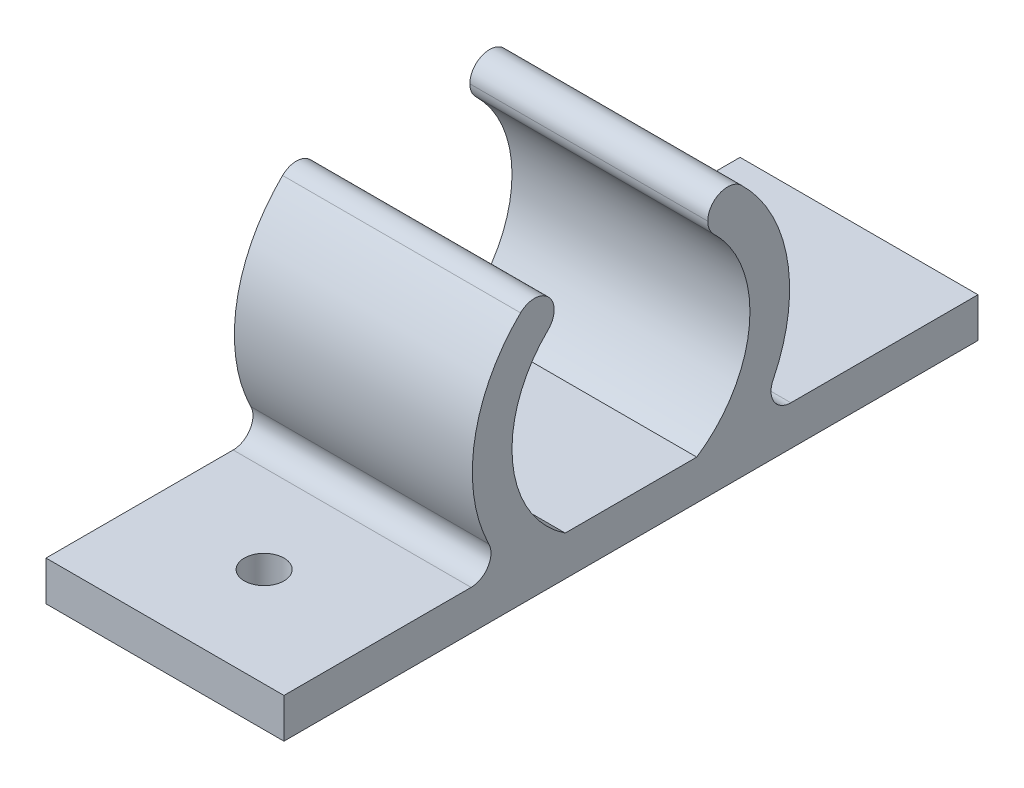
ISO-10303-21;
HEADER;
FILE_DESCRIPTION(('STEP AP214'),'2;1');
FILE_NAME('part.step','',(''),(''),'','','');
FILE_SCHEMA(('AUTOMOTIVE_DESIGN { 1 0 10303 214 1 1 1 1 }'));
ENDSEC;
DATA;
#1=APPLICATION_CONTEXT('core data for automotive mechanical design processes');
#2=APPLICATION_PROTOCOL_DEFINITION('international standard','automotive_design',2000,#1);
#3=PRODUCT_CONTEXT('',#1,'mechanical');
#4=PRODUCT('Part','Part','',(#3));
#5=PRODUCT_RELATED_PRODUCT_CATEGORY('part','',(#4));
#6=PRODUCT_DEFINITION_FORMATION('','',#4);
#7=PRODUCT_DEFINITION_CONTEXT('part definition',#1,'design');
#8=PRODUCT_DEFINITION('design','',#6,#7);
#9=PRODUCT_DEFINITION_SHAPE('','',#8);
#10=(LENGTH_UNIT() NAMED_UNIT(*) SI_UNIT(.MILLI.,.METRE.));
#11=(NAMED_UNIT(*) PLANE_ANGLE_UNIT() SI_UNIT($,.RADIAN.));
#12=(NAMED_UNIT(*) SI_UNIT($,.STERADIAN.) SOLID_ANGLE_UNIT());
#13=UNCERTAINTY_MEASURE_WITH_UNIT(LENGTH_MEASURE(1.E-05),#10,'distance_accuracy_value','');
#14=(GEOMETRIC_REPRESENTATION_CONTEXT(3) GLOBAL_UNCERTAINTY_ASSIGNED_CONTEXT((#13)) GLOBAL_UNIT_ASSIGNED_CONTEXT((#10,
#11,#12)) REPRESENTATION_CONTEXT('',''));
#15=CARTESIAN_POINT('',(0.,0.,0.));
#16=DIRECTION('',(0.,0.,1.));
#17=DIRECTION('',(1.,0.,0.));
#18=AXIS2_PLACEMENT_3D('',#15,#16,#17);
#19=CARTESIAN_POINT('',(12.,5.,-6.));
#20=DIRECTION('',(-1.,0.,0.));
#21=DIRECTION('',(0.,0.,1.));
#22=AXIS2_PLACEMENT_3D('',#19,#20,#21);
#23=CYLINDRICAL_SURFACE('',#22,8.);
#24=CARTESIAN_POINT('',(12.,5.,-6.));
#25=DIRECTION('',(1.,0.,0.));
#26=DIRECTION('',(0.,0.,-1.));
#27=AXIS2_PLACEMENT_3D('',#24,#25,#26);
#28=CIRCLE('',#27,8.);
#29=CARTESIAN_POINT('',(12.,10.7432447127312,-0.430876175762945));
#30=VERTEX_POINT('',#29);
#31=CARTESIAN_POINT('',(12.,1.44444444444444,1.16645133182093));
#32=VERTEX_POINT('',#31);
#33=EDGE_CURVE('E167',#30,#32,#28,.T.);
#34=ORIENTED_EDGE('',*,*,#33,.F.);
#35=DIRECTION('',(-1.,0.,0.));
#36=VECTOR('',#35,1.);
#37=CARTESIAN_POINT('',(12.,10.7432447127312,-0.430876175762943));
#38=LINE('',#37,#36);
#39=CARTESIAN_POINT('',(0.,10.7432447127312,-0.430876175762945));
#40=VERTEX_POINT('',#39);
#41=EDGE_CURVE('E269',#30,#40,#38,.T.);
#42=ORIENTED_EDGE('',*,*,#41,.T.);
#43=CARTESIAN_POINT('',(0.,5.,-6.));
#44=DIRECTION('',(1.,0.,0.));
#45=DIRECTION('',(0.,0.,-1.));
#46=AXIS2_PLACEMENT_3D('',#43,#44,#45);
#47=CIRCLE('',#46,8.);
#48=CARTESIAN_POINT('',(0.,1.44444444444444,1.16645133182093));
#49=VERTEX_POINT('',#48);
#50=EDGE_CURVE('E203',#40,#49,#47,.T.);
#51=ORIENTED_EDGE('',*,*,#50,.T.);
#52=DIRECTION('',(-1.,0.,0.));
#53=VECTOR('',#52,1.);
#54=CARTESIAN_POINT('',(12.,1.44444444444444,1.16645133182093));
#55=LINE('',#54,#53);
#56=EDGE_CURVE('E267',#49,#32,#55,.F.);
#57=ORIENTED_EDGE('',*,*,#56,.T.);
#58=EDGE_LOOP('',(#34,#42,#51,#57));
#59=FACE_BOUND('',#58,.T.);
#60=ADVANCED_FACE('F43',(#59),#23,.T.);
#61=CARTESIAN_POINT('',(12.,0.,0.));
#62=DIRECTION('',(0.,-1.,0.));
#63=DIRECTION('',(0.,0.,-1.));
#64=AXIS2_PLACEMENT_3D('',#61,#62,#63);
#65=PLANE('',#64);
#66=CARTESIAN_POINT('',(6.,0.,6.5));
#67=DIRECTION('',(0.,-1.,0.));
#68=DIRECTION('',(0.,0.,-1.));
#69=AXIS2_PLACEMENT_3D('',#66,#67,#68);
#70=CIRCLE('',#69,1.);
#71=CARTESIAN_POINT('',(6.,0.,5.5));
#72=VERTEX_POINT('',#71);
#73=EDGE_CURVE('E206',#72,#72,#70,.T.);
#74=ORIENTED_EDGE('',*,*,#73,.T.);
#75=EDGE_LOOP('',(#74));
#76=FACE_BOUND('',#75,.T.);
#77=DIRECTION('',(0.,0.,1.));
#78=VECTOR('',#77,1.);
#79=CARTESIAN_POINT('',(12.,0.,0.));
#80=LINE('',#79,#78);
#81=CARTESIAN_POINT('',(12.,0.,2.06225774829855));
#82=VERTEX_POINT('',#81);
#83=CARTESIAN_POINT('',(12.,0.,11.5));
#84=VERTEX_POINT('',#83);
#85=EDGE_CURVE('E156',#82,#84,#80,.T.);
#86=ORIENTED_EDGE('',*,*,#85,.F.);
#87=DIRECTION('',(1.,0.,0.));
#88=VECTOR('',#87,1.);
#89=CARTESIAN_POINT('',(0.,0.,2.06225774829855));
#90=LINE('',#89,#88);
#91=CARTESIAN_POINT('',(0.,0.,2.06225774829855));
#92=VERTEX_POINT('',#91);
#93=EDGE_CURVE('E273',#82,#92,#90,.F.);
#94=ORIENTED_EDGE('',*,*,#93,.T.);
#95=DIRECTION('',(0.,0.,1.));
#96=VECTOR('',#95,1.);
#97=CARTESIAN_POINT('',(0.,0.,0.));
#98=LINE('',#97,#96);
#99=CARTESIAN_POINT('',(0.,0.,11.5));
#100=VERTEX_POINT('',#99);
#101=EDGE_CURVE('E173',#92,#100,#98,.T.);
#102=ORIENTED_EDGE('',*,*,#101,.T.);
#103=DIRECTION('',(-1.,0.,0.));
#104=VECTOR('',#103,1.);
#105=CARTESIAN_POINT('',(12.,0.,11.5));
#106=LINE('',#105,#104);
#107=EDGE_CURVE('E170',#84,#100,#106,.T.);
#108=ORIENTED_EDGE('',*,*,#107,.F.);
#109=EDGE_LOOP('',(#86,#94,#102,#108));
#110=FACE_BOUND('',#109,.T.);
#111=ADVANCED_FACE('F171',(#76,#110),#65,.F.);
#112=CARTESIAN_POINT('',(12.,0.,11.5));
#113=DIRECTION('',(0.,0.,-1.));
#114=DIRECTION('',(-1.,0.,0.));
#115=AXIS2_PLACEMENT_3D('',#112,#113,#114);
#116=PLANE('',#115);
#117=DIRECTION('',(0.,-1.,0.));
#118=VECTOR('',#117,1.);
#119=CARTESIAN_POINT('',(0.,0.,11.5));
#120=LINE('',#119,#118);
#121=CARTESIAN_POINT('',(0.,-2.,11.5));
#122=VERTEX_POINT('',#121);
#123=EDGE_CURVE('E208',#100,#122,#120,.T.);
#124=ORIENTED_EDGE('',*,*,#123,.T.);
#125=DIRECTION('',(-1.,0.,0.));
#126=VECTOR('',#125,1.);
#127=CARTESIAN_POINT('',(12.,-2.,11.5));
#128=LINE('',#127,#126);
#129=CARTESIAN_POINT('',(12.,-2.,11.5));
#130=VERTEX_POINT('',#129);
#131=EDGE_CURVE('E177',#130,#122,#128,.T.);
#132=ORIENTED_EDGE('',*,*,#131,.F.);
#133=DIRECTION('',(0.,-1.,0.));
#134=VECTOR('',#133,1.);
#135=CARTESIAN_POINT('',(12.,0.,11.5));
#136=LINE('',#135,#134);
#137=EDGE_CURVE('E160',#84,#130,#136,.T.);
#138=ORIENTED_EDGE('',*,*,#137,.F.);
#139=ORIENTED_EDGE('',*,*,#107,.T.);
#140=EDGE_LOOP('',(#124,#132,#138,#139));
#141=FACE_BOUND('',#140,.T.);
#142=ADVANCED_FACE('F179',(#141),#116,.F.);
#143=CARTESIAN_POINT('',(12.,-2.,0.));
#144=DIRECTION('',(0.,1.,0.));
#145=DIRECTION('',(0.,0.,1.));
#146=AXIS2_PLACEMENT_3D('',#143,#144,#145);
#147=PLANE('',#146);
#148=CARTESIAN_POINT('',(6.,-2.,6.5));
#149=DIRECTION('',(0.,-1.,0.));
#150=DIRECTION('',(0.,0.,-1.));
#151=AXIS2_PLACEMENT_3D('',#148,#149,#150);
#152=CIRCLE('',#151,1.);
#153=CARTESIAN_POINT('',(6.,-2.,5.5));
#154=VERTEX_POINT('',#153);
#155=EDGE_CURVE('E242',#154,#154,#152,.T.);
#156=ORIENTED_EDGE('',*,*,#155,.F.);
#157=EDGE_LOOP('',(#156));
#158=FACE_BOUND('',#157,.T.);
#159=CARTESIAN_POINT('',(6.,-2.,-18.5));
#160=DIRECTION('',(0.,-1.,0.));
#161=DIRECTION('',(0.,0.,-1.));
#162=AXIS2_PLACEMENT_3D('',#159,#160,#161);
#163=CIRCLE('',#162,1.);
#164=CARTESIAN_POINT('',(6.,-2.,-19.5));
#165=VERTEX_POINT('',#164);
#166=EDGE_CURVE('E281',#165,#165,#163,.T.);
#167=ORIENTED_EDGE('',*,*,#166,.F.);
#168=EDGE_LOOP('',(#167));
#169=FACE_BOUND('',#168,.T.);
#170=DIRECTION('',(0.,0.,-1.));
#171=VECTOR('',#170,1.);
#172=CARTESIAN_POINT('',(0.,-2.,0.));
#173=LINE('',#172,#171);
#174=CARTESIAN_POINT('',(0.,-2.,-23.5));
#175=VERTEX_POINT('',#174);
#176=EDGE_CURVE('E210',#122,#175,#173,.T.);
#177=ORIENTED_EDGE('',*,*,#176,.T.);
#178=DIRECTION('',(-1.,0.,0.));
#179=VECTOR('',#178,1.);
#180=CARTESIAN_POINT('',(12.,-2.,-23.5));
#181=LINE('',#180,#179);
#182=CARTESIAN_POINT('',(12.,-2.,-23.5));
#183=VERTEX_POINT('',#182);
#184=EDGE_CURVE('E236',#183,#175,#181,.T.);
#185=ORIENTED_EDGE('',*,*,#184,.F.);
#186=DIRECTION('',(0.,0.,-1.));
#187=VECTOR('',#186,1.);
#188=CARTESIAN_POINT('',(12.,-2.,0.));
#189=LINE('',#188,#187);
#190=EDGE_CURVE('E182',#130,#183,#189,.T.);
#191=ORIENTED_EDGE('',*,*,#190,.F.);
#192=ORIENTED_EDGE('',*,*,#131,.T.);
#193=EDGE_LOOP('',(#177,#185,#191,#192));
#194=FACE_BOUND('',#193,.T.);
#195=ADVANCED_FACE('F318',(#158,#169,#194),#147,.F.);
#196=CARTESIAN_POINT('',(12.,0.,-23.5));
#197=DIRECTION('',(0.,0.,-1.));
#198=DIRECTION('',(-1.,0.,0.));
#199=AXIS2_PLACEMENT_3D('',#196,#197,#198);
#200=PLANE('',#199);
#201=DIRECTION('',(0.,-1.,0.));
#202=VECTOR('',#201,1.);
#203=CARTESIAN_POINT('',(0.,0.,-23.5));
#204=LINE('',#203,#202);
#205=CARTESIAN_POINT('',(0.,0.,-23.5));
#206=VERTEX_POINT('',#205);
#207=EDGE_CURVE('E213',#206,#175,#204,.T.);
#208=ORIENTED_EDGE('',*,*,#207,.F.);
#209=DIRECTION('',(-1.,0.,0.));
#210=VECTOR('',#209,1.);
#211=CARTESIAN_POINT('',(12.,0.,-23.5));
#212=LINE('',#211,#210);
#213=CARTESIAN_POINT('',(12.,0.,-23.5));
#214=VERTEX_POINT('',#213);
#215=EDGE_CURVE('E233',#214,#206,#212,.T.);
#216=ORIENTED_EDGE('',*,*,#215,.F.);
#217=DIRECTION('',(0.,-1.,0.));
#218=VECTOR('',#217,1.);
#219=CARTESIAN_POINT('',(12.,0.,-23.5));
#220=LINE('',#219,#218);
#221=EDGE_CURVE('E184',#214,#183,#220,.T.);
#222=ORIENTED_EDGE('',*,*,#221,.T.);
#223=ORIENTED_EDGE('',*,*,#184,.T.);
#224=EDGE_LOOP('',(#208,#216,#222,#223));
#225=FACE_BOUND('',#224,.T.);
#226=ADVANCED_FACE('F314',(#225),#200,.T.);
#227=CARTESIAN_POINT('',(12.,0.,0.));
#228=DIRECTION('',(0.,1.,0.));
#229=DIRECTION('',(0.,0.,1.));
#230=AXIS2_PLACEMENT_3D('',#227,#228,#229);
#231=PLANE('',#230);
#232=CARTESIAN_POINT('',(6.,0.,-18.5));
#233=DIRECTION('',(0.,1.,0.));
#234=DIRECTION('',(0.,0.,1.));
#235=AXIS2_PLACEMENT_3D('',#232,#233,#234);
#236=CIRCLE('',#235,1.);
#237=CARTESIAN_POINT('',(6.,0.,-19.5));
#238=VERTEX_POINT('',#237);
#239=EDGE_CURVE('E239',#238,#238,#236,.T.);
#240=ORIENTED_EDGE('',*,*,#239,.F.);
#241=EDGE_LOOP('',(#240));
#242=FACE_BOUND('',#241,.T.);
#243=DIRECTION('',(0.,0.,-1.));
#244=VECTOR('',#243,1.);
#245=CARTESIAN_POINT('',(0.,0.,0.));
#246=LINE('',#245,#244);
#247=CARTESIAN_POINT('',(0.,0.,-14.0622577482986));
#248=VERTEX_POINT('',#247);
#249=EDGE_CURVE('E216',#248,#206,#246,.T.);
#250=ORIENTED_EDGE('',*,*,#249,.F.);
#251=DIRECTION('',(-1.,0.,0.));
#252=VECTOR('',#251,1.);
#253=CARTESIAN_POINT('',(12.,0.,-14.0622577482986));
#254=LINE('',#253,#252);
#255=CARTESIAN_POINT('',(12.,0.,-14.0622577482986));
#256=VERTEX_POINT('',#255);
#257=EDGE_CURVE('E271',#248,#256,#254,.F.);
#258=ORIENTED_EDGE('',*,*,#257,.T.);
#259=DIRECTION('',(0.,0.,-1.));
#260=VECTOR('',#259,1.);
#261=CARTESIAN_POINT('',(12.,0.,0.));
#262=LINE('',#261,#260);
#263=EDGE_CURVE('E190',#256,#214,#262,.T.);
#264=ORIENTED_EDGE('',*,*,#263,.T.);
#265=ORIENTED_EDGE('',*,*,#215,.T.);
#266=EDGE_LOOP('',(#250,#258,#264,#265));
#267=FACE_BOUND('',#266,.T.);
#268=ADVANCED_FACE('F308',(#242,#267),#231,.T.);
#269=CARTESIAN_POINT('',(12.,5.,-6.));
#270=DIRECTION('',(-1.,0.,0.));
#271=DIRECTION('',(0.,0.,1.));
#272=AXIS2_PLACEMENT_3D('',#269,#270,#271);
#273=CYLINDRICAL_SURFACE('',#272,8.);
#274=CARTESIAN_POINT('',(0.,5.,-6.));
#275=DIRECTION('',(1.,0.,0.));
#276=DIRECTION('',(0.,0.,-1.));
#277=AXIS2_PLACEMENT_3D('',#274,#275,#276);
#278=CIRCLE('',#277,8.);
#279=CARTESIAN_POINT('',(0.,1.44444444444445,-13.1664513318209));
#280=VERTEX_POINT('',#279);
#281=CARTESIAN_POINT('',(0.,10.7432447127312,-11.5691238242371));
#282=VERTEX_POINT('',#281);
#283=EDGE_CURVE('E218',#280,#282,#278,.T.);
#284=ORIENTED_EDGE('',*,*,#283,.T.);
#285=DIRECTION('',(-1.,0.,0.));
#286=VECTOR('',#285,1.);
#287=CARTESIAN_POINT('',(12.,10.7432447127312,-11.5691238242371));
#288=LINE('',#287,#286);
#289=CARTESIAN_POINT('',(12.,10.7432447127312,-11.5691238242371));
#290=VERTEX_POINT('',#289);
#291=EDGE_CURVE('E265',#282,#290,#288,.F.);
#292=ORIENTED_EDGE('',*,*,#291,.T.);
#293=CARTESIAN_POINT('',(12.,5.,-6.));
#294=DIRECTION('',(1.,0.,0.));
#295=DIRECTION('',(0.,0.,-1.));
#296=AXIS2_PLACEMENT_3D('',#293,#294,#295);
#297=CIRCLE('',#296,8.);
#298=CARTESIAN_POINT('',(12.,1.44444444444445,-13.1664513318209));
#299=VERTEX_POINT('',#298);
#300=EDGE_CURVE('E192',#299,#290,#297,.T.);
#301=ORIENTED_EDGE('',*,*,#300,.F.);
#302=DIRECTION('',(-1.,0.,0.));
#303=VECTOR('',#302,1.);
#304=CARTESIAN_POINT('',(12.,1.44444444444445,-13.1664513318209));
#305=LINE('',#304,#303);
#306=EDGE_CURVE('E262',#299,#280,#305,.T.);
#307=ORIENTED_EDGE('',*,*,#306,.T.);
#308=EDGE_LOOP('',(#284,#292,#301,#307));
#309=FACE_BOUND('',#308,.T.);
#310=ADVANCED_FACE('F299',(#309),#273,.T.);
#311=CARTESIAN_POINT('',(12.,5.,-6.));
#312=DIRECTION('',(-1.,0.,0.));
#313=DIRECTION('',(0.,0.,1.));
#314=AXIS2_PLACEMENT_3D('',#311,#312,#313);
#315=CYLINDRICAL_SURFACE('',#314,6.);
#316=CARTESIAN_POINT('',(12.,5.,-6.));
#317=DIRECTION('',(1.,0.,0.));
#318=DIRECTION('',(0.,0.,-1.));
#319=AXIS2_PLACEMENT_3D('',#316,#317,#318);
#320=CIRCLE('',#319,6.);
#321=CARTESIAN_POINT('',(12.,0.,-9.3166247903554));
#322=VERTEX_POINT('',#321);
#323=CARTESIAN_POINT('',(12.,9.30743353454843,-10.1768428681778));
#324=VERTEX_POINT('',#323);
#325=EDGE_CURVE('E194',#322,#324,#320,.T.);
#326=ORIENTED_EDGE('',*,*,#325,.T.);
#327=DIRECTION('',(-1.,0.,0.));
#328=VECTOR('',#327,1.);
#329=CARTESIAN_POINT('',(12.,9.30743353454843,-10.1768428681778));
#330=LINE('',#329,#328);
#331=CARTESIAN_POINT('',(0.,9.30743353454843,-10.1768428681778));
#332=VERTEX_POINT('',#331);
#333=EDGE_CURVE('E259',#324,#332,#330,.T.);
#334=ORIENTED_EDGE('',*,*,#333,.T.);
#335=CARTESIAN_POINT('',(0.,5.,-6.));
#336=DIRECTION('',(1.,0.,0.));
#337=DIRECTION('',(0.,0.,-1.));
#338=AXIS2_PLACEMENT_3D('',#335,#336,#337);
#339=CIRCLE('',#338,6.);
#340=CARTESIAN_POINT('',(0.,0.,-9.3166247903554));
#341=VERTEX_POINT('',#340);
#342=EDGE_CURVE('E221',#341,#332,#339,.T.);
#343=ORIENTED_EDGE('',*,*,#342,.F.);
#344=DIRECTION('',(-1.,0.,0.));
#345=VECTOR('',#344,1.);
#346=CARTESIAN_POINT('',(12.,0.,-9.3166247903554));
#347=LINE('',#346,#345);
#348=EDGE_CURVE('E231',#322,#341,#347,.T.);
#349=ORIENTED_EDGE('',*,*,#348,.F.);
#350=EDGE_LOOP('',(#326,#334,#343,#349));
#351=FACE_BOUND('',#350,.T.);
#352=ADVANCED_FACE('F378',(#351),#315,.F.);
#353=CARTESIAN_POINT('',(12.,0.,0.));
#354=DIRECTION('',(0.,1.,0.));
#355=DIRECTION('',(0.,0.,1.));
#356=AXIS2_PLACEMENT_3D('',#353,#354,#355);
#357=PLANE('',#356);
#358=DIRECTION('',(0.,0.,-1.));
#359=VECTOR('',#358,1.);
#360=CARTESIAN_POINT('',(0.,0.,0.));
#361=LINE('',#360,#359);
#362=CARTESIAN_POINT('',(0.,0.,-2.68337520964461));
#363=VERTEX_POINT('',#362);
#364=EDGE_CURVE('E224',#363,#341,#361,.T.);
#365=ORIENTED_EDGE('',*,*,#364,.F.);
#366=DIRECTION('',(-1.,0.,0.));
#367=VECTOR('',#366,1.);
#368=CARTESIAN_POINT('',(12.,0.,-2.68337520964461));
#369=LINE('',#368,#367);
#370=CARTESIAN_POINT('',(12.,0.,-2.68337520964461));
#371=VERTEX_POINT('',#370);
#372=EDGE_CURVE('E202',#371,#363,#369,.T.);
#373=ORIENTED_EDGE('',*,*,#372,.F.);
#374=DIRECTION('',(0.,0.,-1.));
#375=VECTOR('',#374,1.);
#376=CARTESIAN_POINT('',(12.,0.,0.));
#377=LINE('',#376,#375);
#378=EDGE_CURVE('E196',#371,#322,#377,.T.);
#379=ORIENTED_EDGE('',*,*,#378,.T.);
#380=ORIENTED_EDGE('',*,*,#348,.T.);
#381=EDGE_LOOP('',(#365,#373,#379,#380));
#382=FACE_BOUND('',#381,.T.);
#383=ADVANCED_FACE('F375',(#382),#357,.T.);
#384=CARTESIAN_POINT('',(12.,5.,-6.));
#385=DIRECTION('',(-1.,0.,0.));
#386=DIRECTION('',(0.,0.,1.));
#387=AXIS2_PLACEMENT_3D('',#384,#385,#386);
#388=CYLINDRICAL_SURFACE('',#387,6.);
#389=CARTESIAN_POINT('',(0.,5.,-6.));
#390=DIRECTION('',(1.,0.,0.));
#391=DIRECTION('',(0.,0.,-1.));
#392=AXIS2_PLACEMENT_3D('',#389,#390,#391);
#393=CIRCLE('',#392,6.);
#394=CARTESIAN_POINT('',(0.,9.30743353454842,-1.82315713182221));
#395=VERTEX_POINT('',#394);
#396=EDGE_CURVE('E227',#363,#395,#393,.F.);
#397=ORIENTED_EDGE('',*,*,#396,.T.);
#398=DIRECTION('',(-1.,0.,0.));
#399=VECTOR('',#398,1.);
#400=CARTESIAN_POINT('',(12.,9.30743353454843,-1.82315713182221));
#401=LINE('',#400,#399);
#402=CARTESIAN_POINT('',(12.,9.30743353454842,-1.82315713182221));
#403=VERTEX_POINT('',#402);
#404=EDGE_CURVE('E250',#395,#403,#401,.F.);
#405=ORIENTED_EDGE('',*,*,#404,.T.);
#406=CARTESIAN_POINT('',(12.,5.,-6.));
#407=DIRECTION('',(1.,0.,0.));
#408=DIRECTION('',(0.,0.,-1.));
#409=AXIS2_PLACEMENT_3D('',#406,#407,#408);
#410=CIRCLE('',#409,6.);
#411=EDGE_CURVE('E199',#371,#403,#410,.F.);
#412=ORIENTED_EDGE('',*,*,#411,.F.);
#413=ORIENTED_EDGE('',*,*,#372,.T.);
#414=EDGE_LOOP('',(#397,#405,#412,#413));
#415=FACE_BOUND('',#414,.T.);
#416=ADVANCED_FACE('F371',(#415),#388,.F.);
#417=CARTESIAN_POINT('',(12.,0.,0.));
#418=DIRECTION('',(1.,0.,0.));
#419=DIRECTION('',(0.,0.,-1.));
#420=AXIS2_PLACEMENT_3D('',#417,#418,#419);
#421=PLANE('',#420);
#422=CARTESIAN_POINT('',(12.,10.0253391236398,-10.8729833462074));
#423=DIRECTION('',(1.,0.,0.));
#424=DIRECTION('',(0.,0.,-1.));
#425=AXIS2_PLACEMENT_3D('',#422,#423,#424);
#426=CIRCLE('',#425,1.);
#427=CARTESIAN_POINT('',(12.,10.0253391236398,-9.87298334620742));
#428=VERTEX_POINT('',#427);
#429=EDGE_CURVE('E65',#290,#428,#426,.T.);
#430=ORIENTED_EDGE('',*,*,#429,.T.);
#431=CARTESIAN_POINT('',(12.,10.0253391236398,-10.8729833462074));
#432=DIRECTION('',(1.,0.,0.));
#433=DIRECTION('',(0.,0.,-1.));
#434=AXIS2_PLACEMENT_3D('',#431,#432,#433);
#435=CIRCLE('',#434,1.);
#436=EDGE_CURVE('E60',#428,#324,#435,.T.);
#437=ORIENTED_EDGE('',*,*,#436,.T.);
#438=ORIENTED_EDGE('',*,*,#325,.F.);
#439=ORIENTED_EDGE('',*,*,#378,.F.);
#440=ORIENTED_EDGE('',*,*,#411,.T.);
#441=CARTESIAN_POINT('',(12.,10.0253391236398,-1.12701665379258));
#442=DIRECTION('',(1.,0.,0.));
#443=DIRECTION('',(0.,0.,-1.));
#444=AXIS2_PLACEMENT_3D('',#441,#442,#443);
#445=CIRCLE('',#444,1.);
#446=CARTESIAN_POINT('',(12.,10.0253391236398,-2.12701665379258));
#447=VERTEX_POINT('',#446);
#448=EDGE_CURVE('E255',#403,#447,#445,.T.);
#449=ORIENTED_EDGE('',*,*,#448,.T.);
#450=CARTESIAN_POINT('',(12.,10.0253391236398,-1.12701665379258));
#451=DIRECTION('',(1.,0.,0.));
#452=DIRECTION('',(0.,0.,-1.));
#453=AXIS2_PLACEMENT_3D('',#450,#451,#452);
#454=CIRCLE('',#453,1.);
#455=EDGE_CURVE('E253',#447,#30,#454,.T.);
#456=ORIENTED_EDGE('',*,*,#455,.T.);
#457=ORIENTED_EDGE('',*,*,#33,.T.);
#458=CARTESIAN_POINT('',(12.,1.,2.06225774829855));
#459=DIRECTION('',(1.,0.,0.));
#460=DIRECTION('',(0.,0.,-1.));
#461=AXIS2_PLACEMENT_3D('',#458,#459,#460);
#462=CIRCLE('',#461,1.);
#463=EDGE_CURVE('E11',#32,#82,#462,.F.);
#464=ORIENTED_EDGE('',*,*,#463,.T.);
#465=ORIENTED_EDGE('',*,*,#85,.T.);
#466=ORIENTED_EDGE('',*,*,#137,.T.);
#467=ORIENTED_EDGE('',*,*,#190,.T.);
#468=ORIENTED_EDGE('',*,*,#221,.F.);
#469=ORIENTED_EDGE('',*,*,#263,.F.);
#470=CARTESIAN_POINT('',(12.,1.,-14.0622577482986));
#471=DIRECTION('',(1.,0.,0.));
#472=DIRECTION('',(0.,0.,-1.));
#473=AXIS2_PLACEMENT_3D('',#470,#471,#472);
#474=CIRCLE('',#473,1.);
#475=EDGE_CURVE('E277',#256,#299,#474,.F.);
#476=ORIENTED_EDGE('',*,*,#475,.T.);
#477=ORIENTED_EDGE('',*,*,#300,.T.);
#478=EDGE_LOOP('',(#430,#437,#438,#439,#440,#449,#456,#457,#464,#465,#466,#467,#468,#469,#476,#477));
#479=FACE_BOUND('',#478,.T.);
#480=ADVANCED_FACE('F158',(#479),#421,.T.);
#481=CARTESIAN_POINT('',(0.,0.,0.));
#482=DIRECTION('',(1.,0.,0.));
#483=DIRECTION('',(0.,0.,-1.));
#484=AXIS2_PLACEMENT_3D('',#481,#482,#483);
#485=PLANE('',#484);
#486=ORIENTED_EDGE('',*,*,#342,.T.);
#487=CARTESIAN_POINT('',(0.,10.0253391236398,-10.8729833462074));
#488=DIRECTION('',(1.,0.,0.));
#489=DIRECTION('',(0.,0.,-1.));
#490=AXIS2_PLACEMENT_3D('',#487,#488,#489);
#491=CIRCLE('',#490,1.);
#492=CARTESIAN_POINT('',(0.,10.0253391236398,-9.87298334620742));
#493=VERTEX_POINT('',#492);
#494=EDGE_CURVE('E248',#332,#493,#491,.F.);
#495=ORIENTED_EDGE('',*,*,#494,.T.);
#496=CARTESIAN_POINT('',(0.,10.0253391236398,-10.8729833462074));
#497=DIRECTION('',(1.,0.,0.));
#498=DIRECTION('',(0.,0.,-1.));
#499=AXIS2_PLACEMENT_3D('',#496,#497,#498);
#500=CIRCLE('',#499,1.);
#501=EDGE_CURVE('E246',#493,#282,#500,.F.);
#502=ORIENTED_EDGE('',*,*,#501,.T.);
#503=ORIENTED_EDGE('',*,*,#283,.F.);
#504=CARTESIAN_POINT('',(0.,1.,-14.0622577482986));
#505=DIRECTION('',(1.,0.,0.));
#506=DIRECTION('',(0.,0.,-1.));
#507=AXIS2_PLACEMENT_3D('',#504,#505,#506);
#508=CIRCLE('',#507,1.);
#509=EDGE_CURVE('E275',#280,#248,#508,.T.);
#510=ORIENTED_EDGE('',*,*,#509,.T.);
#511=ORIENTED_EDGE('',*,*,#249,.T.);
#512=ORIENTED_EDGE('',*,*,#207,.T.);
#513=ORIENTED_EDGE('',*,*,#176,.F.);
#514=ORIENTED_EDGE('',*,*,#123,.F.);
#515=ORIENTED_EDGE('',*,*,#101,.F.);
#516=CARTESIAN_POINT('',(0.,1.,2.06225774829855));
#517=DIRECTION('',(1.,0.,0.));
#518=DIRECTION('',(0.,0.,-1.));
#519=AXIS2_PLACEMENT_3D('',#516,#517,#518);
#520=CIRCLE('',#519,1.);
#521=EDGE_CURVE('E52',#92,#49,#520,.T.);
#522=ORIENTED_EDGE('',*,*,#521,.T.);
#523=ORIENTED_EDGE('',*,*,#50,.F.);
#524=CARTESIAN_POINT('',(0.,10.0253391236398,-1.12701665379258));
#525=DIRECTION('',(1.,0.,0.));
#526=DIRECTION('',(0.,0.,-1.));
#527=AXIS2_PLACEMENT_3D('',#524,#525,#526);
#528=CIRCLE('',#527,1.);
#529=CARTESIAN_POINT('',(0.,10.0253391236398,-2.12701665379258));
#530=VERTEX_POINT('',#529);
#531=EDGE_CURVE('E176',#40,#530,#528,.F.);
#532=ORIENTED_EDGE('',*,*,#531,.T.);
#533=CARTESIAN_POINT('',(0.,10.0253391236398,-1.12701665379258));
#534=DIRECTION('',(1.,0.,0.));
#535=DIRECTION('',(0.,0.,-1.));
#536=AXIS2_PLACEMENT_3D('',#533,#534,#535);
#537=CIRCLE('',#536,1.);
#538=EDGE_CURVE('E244',#530,#395,#537,.F.);
#539=ORIENTED_EDGE('',*,*,#538,.T.);
#540=ORIENTED_EDGE('',*,*,#396,.F.);
#541=ORIENTED_EDGE('',*,*,#364,.T.);
#542=EDGE_LOOP('',(#486,#495,#502,#503,#510,#511,#512,#513,#514,#515,#522,#523,#532,#539,#540,#541));
#543=FACE_BOUND('',#542,.T.);
#544=ADVANCED_FACE('F297',(#543),#485,.F.);
#545=CARTESIAN_POINT('',(6.,11.,-18.5));
#546=DIRECTION('',(0.,-1.,0.));
#547=DIRECTION('',(0.,0.,-1.));
#548=AXIS2_PLACEMENT_3D('',#545,#546,#547);
#549=CYLINDRICAL_SURFACE('',#548,1.);
#550=CARTESIAN_POINT('',(6.,0.,-19.5));
#551=CARTESIAN_POINT('',(6.,-0.0208333333333351,-19.5));
#552=CARTESIAN_POINT('',(6.,-0.0416666666666684,-19.5));
#553=CARTESIAN_POINT('',(6.,-0.0833333333333352,-19.5));
#554=CARTESIAN_POINT('',(6.,-0.104166666666669,-19.5));
#555=CARTESIAN_POINT('',(6.,-0.145833333333335,-19.5));
#556=CARTESIAN_POINT('',(6.,-0.166666666666669,-19.5));
#557=CARTESIAN_POINT('',(6.,-0.208333333333335,-19.5));
#558=CARTESIAN_POINT('',(6.,-0.229166666666669,-19.5));
#559=CARTESIAN_POINT('',(6.,-0.270833333333335,-19.5));
#560=CARTESIAN_POINT('',(6.,-0.291666666666669,-19.5));
#561=CARTESIAN_POINT('',(6.,-0.333333333333335,-19.5));
#562=CARTESIAN_POINT('',(6.,-0.354166666666669,-19.5));
#563=CARTESIAN_POINT('',(6.,-0.395833333333335,-19.5));
#564=CARTESIAN_POINT('',(6.,-0.416666666666669,-19.5));
#565=CARTESIAN_POINT('',(6.,-0.458333333333335,-19.5));
#566=CARTESIAN_POINT('',(6.,-0.479166666666669,-19.5));
#567=CARTESIAN_POINT('',(6.,-0.520833333333335,-19.5));
#568=CARTESIAN_POINT('',(6.,-0.541666666666668,-19.5));
#569=CARTESIAN_POINT('',(6.,-0.583333333333334,-19.5));
#570=CARTESIAN_POINT('',(6.,-0.604166666666667,-19.5));
#571=CARTESIAN_POINT('',(6.,-0.645833333333334,-19.5));
#572=CARTESIAN_POINT('',(6.,-0.666666666666667,-19.5));
#573=CARTESIAN_POINT('',(6.,-0.708333333333334,-19.5));
#574=CARTESIAN_POINT('',(6.,-0.729166666666667,-19.5));
#575=CARTESIAN_POINT('',(6.,-0.770833333333334,-19.5));
#576=CARTESIAN_POINT('',(6.,-0.791666666666667,-19.5));
#577=CARTESIAN_POINT('',(6.,-0.833333333333334,-19.5));
#578=CARTESIAN_POINT('',(6.,-0.854166666666667,-19.5));
#579=CARTESIAN_POINT('',(6.,-0.895833333333334,-19.5));
#580=CARTESIAN_POINT('',(6.,-0.916666666666668,-19.5));
#581=CARTESIAN_POINT('',(6.,-0.958333333333334,-19.5));
#582=CARTESIAN_POINT('',(6.,-0.979166666666668,-19.5));
#583=CARTESIAN_POINT('',(6.,-1.02083333333333,-19.5));
#584=CARTESIAN_POINT('',(6.,-1.04166666666667,-19.5));
#585=CARTESIAN_POINT('',(6.,-1.08333333333333,-19.5));
#586=CARTESIAN_POINT('',(6.,-1.10416666666667,-19.5));
#587=CARTESIAN_POINT('',(6.,-1.14583333333333,-19.5));
#588=CARTESIAN_POINT('',(6.,-1.16666666666667,-19.5));
#589=CARTESIAN_POINT('',(6.,-1.20833333333333,-19.5));
#590=CARTESIAN_POINT('',(6.,-1.22916666666667,-19.5));
#591=CARTESIAN_POINT('',(6.,-1.27083333333333,-19.5));
#592=CARTESIAN_POINT('',(6.,-1.29166666666667,-19.5));
#593=CARTESIAN_POINT('',(6.,-1.33333333333333,-19.5));
#594=CARTESIAN_POINT('',(6.,-1.35416666666667,-19.5));
#595=CARTESIAN_POINT('',(6.,-1.39583333333333,-19.5));
#596=CARTESIAN_POINT('',(6.,-1.41666666666667,-19.5));
#597=CARTESIAN_POINT('',(6.,-1.45833333333333,-19.5));
#598=CARTESIAN_POINT('',(6.,-1.47916666666667,-19.5));
#599=CARTESIAN_POINT('',(6.,-1.52083333333333,-19.5));
#600=CARTESIAN_POINT('',(6.,-1.54166666666667,-19.5));
#601=CARTESIAN_POINT('',(6.,-1.58333333333333,-19.5));
#602=CARTESIAN_POINT('',(6.,-1.60416666666667,-19.5));
#603=CARTESIAN_POINT('',(6.,-1.64583333333333,-19.5));
#604=CARTESIAN_POINT('',(6.,-1.66666666666667,-19.5));
#605=CARTESIAN_POINT('',(6.,-1.70833333333333,-19.5));
#606=CARTESIAN_POINT('',(6.,-1.72916666666667,-19.5));
#607=CARTESIAN_POINT('',(6.,-1.77083333333333,-19.5));
#608=CARTESIAN_POINT('',(6.,-1.79166666666667,-19.5));
#609=CARTESIAN_POINT('',(6.,-1.83333333333333,-19.5));
#610=CARTESIAN_POINT('',(6.,-1.85416666666667,-19.5));
#611=CARTESIAN_POINT('',(6.,-1.89583333333333,-19.5));
#612=CARTESIAN_POINT('',(6.,-1.91666666666667,-19.5));
#613=CARTESIAN_POINT('',(6.,-1.95833333333333,-19.5));
#614=CARTESIAN_POINT('',(6.,-1.97916666666667,-19.5));
#615=CARTESIAN_POINT('',(6.,-2.,-19.5));
#616=B_SPLINE_CURVE_WITH_KNOTS('',3,(#550,#551,#552,#553,#554,#555,#556,#557,#558,#559,#560,
#561,#562,#563,#564,#565,#566,#567,#568,#569,#570,#571,#572,#573,#574,#575,#576,#577,#578,#579,
#580,#581,#582,#583,#584,#585,#586,#587,#588,#589,#590,#591,#592,#593,#594,#595,#596,#597,#598,
#599,#600,#601,#602,#603,#604,#605,#606,#607,#608,#609,#610,#611,#612,#613,#614,#615),
.UNSPECIFIED.,.F.,.F.,(4,2,2,2,2,2,2,2,2,2,2,2,2,2,2,2,2,2,2,2,2,2,2,2,2,2,2,2,2,2,2,2,4),(0.,
0.0625000000000001,0.125,0.1875,0.25,0.3125,0.375,0.4375,0.5,0.562499999999999,
0.624999999999999,0.687499999999999,0.749999999999999,0.812499999999999,0.874999999999999,
0.937499999999999,0.999999999999999,1.0625,1.125,1.1875,1.25,1.3125,1.375,1.4375,1.5,1.5625,
1.625,1.6875,1.75,1.8125,1.875,1.9375,2.),.UNSPECIFIED.);
#617=EDGE_CURVE('BSEAM398',#238,#165,#616,.T.);
#618=ORIENTED_EDGE('',*,*,#239,.T.);
#619=ORIENTED_EDGE('',*,*,#166,.T.);
#620=ORIENTED_EDGE('',*,*,#617,.T.);
#621=ORIENTED_EDGE('',*,*,#617,.F.);
#622=EDGE_LOOP('',(#618,#620,#619,#621));
#623=FACE_BOUND('',#622,.T.);
#624=ADVANCED_FACE('F398',(#623),#549,.F.);
#625=CARTESIAN_POINT('',(6.,11.,6.5));
#626=DIRECTION('',(0.,-1.,0.));
#627=DIRECTION('',(0.,0.,-1.));
#628=AXIS2_PLACEMENT_3D('',#625,#626,#627);
#629=CYLINDRICAL_SURFACE('',#628,1.);
#630=CARTESIAN_POINT('',(6.,-2.,5.5));
#631=CARTESIAN_POINT('',(6.,-1.97916666666667,5.5));
#632=CARTESIAN_POINT('',(6.,-1.95833333333333,5.5));
#633=CARTESIAN_POINT('',(6.,-1.91666666666667,5.5));
#634=CARTESIAN_POINT('',(6.,-1.89583333333333,5.5));
#635=CARTESIAN_POINT('',(6.,-1.85416666666667,5.5));
#636=CARTESIAN_POINT('',(6.,-1.83333333333333,5.5));
#637=CARTESIAN_POINT('',(6.,-1.79166666666667,5.5));
#638=CARTESIAN_POINT('',(6.,-1.77083333333333,5.5));
#639=CARTESIAN_POINT('',(6.,-1.72916666666667,5.5));
#640=CARTESIAN_POINT('',(6.,-1.70833333333333,5.5));
#641=CARTESIAN_POINT('',(6.,-1.66666666666667,5.5));
#642=CARTESIAN_POINT('',(6.,-1.64583333333333,5.5));
#643=CARTESIAN_POINT('',(6.,-1.60416666666667,5.5));
#644=CARTESIAN_POINT('',(6.,-1.58333333333333,5.5));
#645=CARTESIAN_POINT('',(6.,-1.54166666666667,5.5));
#646=CARTESIAN_POINT('',(6.,-1.52083333333333,5.5));
#647=CARTESIAN_POINT('',(6.,-1.47916666666667,5.5));
#648=CARTESIAN_POINT('',(6.,-1.45833333333333,5.5));
#649=CARTESIAN_POINT('',(6.,-1.41666666666667,5.5));
#650=CARTESIAN_POINT('',(6.,-1.39583333333333,5.5));
#651=CARTESIAN_POINT('',(6.,-1.35416666666667,5.5));
#652=CARTESIAN_POINT('',(6.,-1.33333333333333,5.5));
#653=CARTESIAN_POINT('',(6.,-1.29166666666667,5.5));
#654=CARTESIAN_POINT('',(6.,-1.27083333333333,5.5));
#655=CARTESIAN_POINT('',(6.,-1.22916666666667,5.5));
#656=CARTESIAN_POINT('',(6.,-1.20833333333333,5.5));
#657=CARTESIAN_POINT('',(6.,-1.16666666666667,5.5));
#658=CARTESIAN_POINT('',(6.,-1.14583333333333,5.5));
#659=CARTESIAN_POINT('',(6.,-1.10416666666667,5.5));
#660=CARTESIAN_POINT('',(6.,-1.08333333333333,5.5));
#661=CARTESIAN_POINT('',(6.,-1.04166666666667,5.5));
#662=CARTESIAN_POINT('',(6.,-1.02083333333333,5.5));
#663=CARTESIAN_POINT('',(6.,-0.979166666666666,5.5));
#664=CARTESIAN_POINT('',(6.,-0.958333333333332,5.5));
#665=CARTESIAN_POINT('',(6.,-0.916666666666666,5.5));
#666=CARTESIAN_POINT('',(6.,-0.895833333333332,5.5));
#667=CARTESIAN_POINT('',(6.,-0.854166666666666,5.5));
#668=CARTESIAN_POINT('',(6.,-0.833333333333332,5.5));
#669=CARTESIAN_POINT('',(6.,-0.791666666666666,5.5));
#670=CARTESIAN_POINT('',(6.,-0.770833333333332,5.5));
#671=CARTESIAN_POINT('',(6.,-0.729166666666666,5.5));
#672=CARTESIAN_POINT('',(6.,-0.708333333333332,5.5));
#673=CARTESIAN_POINT('',(6.,-0.666666666666666,5.5));
#674=CARTESIAN_POINT('',(6.,-0.645833333333332,5.5));
#675=CARTESIAN_POINT('',(6.,-0.604166666666666,5.5));
#676=CARTESIAN_POINT('',(6.,-0.583333333333332,5.5));
#677=CARTESIAN_POINT('',(6.,-0.541666666666665,5.5));
#678=CARTESIAN_POINT('',(6.,-0.520833333333332,5.5));
#679=CARTESIAN_POINT('',(6.,-0.479166666666665,5.5));
#680=CARTESIAN_POINT('',(6.,-0.458333333333332,5.5));
#681=CARTESIAN_POINT('',(6.,-0.416666666666665,5.5));
#682=CARTESIAN_POINT('',(6.,-0.395833333333332,5.5));
#683=CARTESIAN_POINT('',(6.,-0.354166666666665,5.5));
#684=CARTESIAN_POINT('',(6.,-0.333333333333332,5.5));
#685=CARTESIAN_POINT('',(6.,-0.291666666666665,5.5));
#686=CARTESIAN_POINT('',(6.,-0.270833333333332,5.5));
#687=CARTESIAN_POINT('',(6.,-0.229166666666665,5.5));
#688=CARTESIAN_POINT('',(6.,-0.208333333333332,5.5));
#689=CARTESIAN_POINT('',(6.,-0.166666666666665,5.5));
#690=CARTESIAN_POINT('',(6.,-0.145833333333332,5.5));
#691=CARTESIAN_POINT('',(6.,-0.104166666666665,5.5));
#692=CARTESIAN_POINT('',(6.,-0.0833333333333317,5.5));
#693=CARTESIAN_POINT('',(6.,-0.041666666666665,5.5));
#694=CARTESIAN_POINT('',(6.,-0.0208333333333316,5.5));
#695=CARTESIAN_POINT('',(6.,0.,5.5));
#696=B_SPLINE_CURVE_WITH_KNOTS('',3,(#630,#631,#632,#633,#634,#635,#636,#637,#638,#639,#640,
#641,#642,#643,#644,#645,#646,#647,#648,#649,#650,#651,#652,#653,#654,#655,#656,#657,#658,#659,
#660,#661,#662,#663,#664,#665,#666,#667,#668,#669,#670,#671,#672,#673,#674,#675,#676,#677,#678,
#679,#680,#681,#682,#683,#684,#685,#686,#687,#688,#689,#690,#691,#692,#693,#694,#695),
.UNSPECIFIED.,.F.,.F.,(4,2,2,2,2,2,2,2,2,2,2,2,2,2,2,2,2,2,2,2,2,2,2,2,2,2,2,2,2,2,2,2,4),(0.,
0.0625000000000001,0.125,0.1875,0.25,0.3125,0.375,0.4375,0.5,0.5625,0.625000000000001,
0.687500000000001,0.750000000000001,0.812500000000001,0.875000000000001,0.937500000000001,1.,
1.0625,1.125,1.1875,1.25,1.3125,1.375,1.4375,1.5,1.5625,1.625,1.6875,1.75,1.8125,1.875,1.9375,
2.),.UNSPECIFIED.);
#697=EDGE_CURVE('BSEAM348',#154,#72,#696,.T.);
#698=ORIENTED_EDGE('',*,*,#155,.T.);
#699=ORIENTED_EDGE('',*,*,#73,.F.);
#700=ORIENTED_EDGE('',*,*,#697,.T.);
#701=ORIENTED_EDGE('',*,*,#697,.F.);
#702=EDGE_LOOP('',(#698,#700,#699,#701));
#703=FACE_BOUND('',#702,.T.);
#704=ADVANCED_FACE('F348',(#703),#629,.F.);
#705=CARTESIAN_POINT('',(12.,10.0253391236398,-1.12701665379258));
#706=DIRECTION('',(-1.,0.,0.));
#707=DIRECTION('',(0.,0.,1.));
#708=AXIS2_PLACEMENT_3D('',#705,#706,#707);
#709=CYLINDRICAL_SURFACE('',#708,1.);
#710=ORIENTED_EDGE('',*,*,#41,.F.);
#711=ORIENTED_EDGE('',*,*,#455,.F.);
#712=DIRECTION('',(1.,0.,0.));
#713=VECTOR('',#712,1.);
#714=CARTESIAN_POINT('',(12.,10.0253391236398,-2.12701665379258));
#715=LINE('',#714,#713);
#716=EDGE_CURVE('E279',#530,#447,#715,.T.);
#717=ORIENTED_EDGE('',*,*,#716,.F.);
#718=ORIENTED_EDGE('',*,*,#531,.F.);
#719=EDGE_LOOP('',(#710,#711,#717,#718));
#720=FACE_BOUND('',#719,.T.);
#721=ADVANCED_FACE('F345',(#720),#709,.T.);
#722=CARTESIAN_POINT('',(12.,10.0253391236398,-1.12701665379258));
#723=DIRECTION('',(-1.,0.,0.));
#724=DIRECTION('',(0.,0.,1.));
#725=AXIS2_PLACEMENT_3D('',#722,#723,#724);
#726=CYLINDRICAL_SURFACE('',#725,1.);
#727=ORIENTED_EDGE('',*,*,#448,.F.);
#728=ORIENTED_EDGE('',*,*,#404,.F.);
#729=ORIENTED_EDGE('',*,*,#538,.F.);
#730=ORIENTED_EDGE('',*,*,#716,.T.);
#731=EDGE_LOOP('',(#727,#728,#729,#730));
#732=FACE_BOUND('',#731,.T.);
#733=ADVANCED_FACE('F342',(#732),#726,.T.);
#734=CARTESIAN_POINT('',(12.,10.0253391236398,-10.8729833462074));
#735=DIRECTION('',(-1.,0.,0.));
#736=DIRECTION('',(0.,0.,1.));
#737=AXIS2_PLACEMENT_3D('',#734,#735,#736);
#738=CYLINDRICAL_SURFACE('',#737,1.);
#739=DIRECTION('',(-1.,0.,0.));
#740=VECTOR('',#739,1.);
#741=CARTESIAN_POINT('',(12.,10.0253391236398,-9.87298334620742));
#742=LINE('',#741,#740);
#743=EDGE_CURVE('E47',#428,#493,#742,.T.);
#744=ORIENTED_EDGE('',*,*,#743,.F.);
#745=ORIENTED_EDGE('',*,*,#429,.F.);
#746=ORIENTED_EDGE('',*,*,#291,.F.);
#747=ORIENTED_EDGE('',*,*,#501,.F.);
#748=EDGE_LOOP('',(#744,#745,#746,#747));
#749=FACE_BOUND('',#748,.T.);
#750=ADVANCED_FACE('F293',(#749),#738,.T.);
#751=CARTESIAN_POINT('',(12.,10.0253391236398,-10.8729833462074));
#752=DIRECTION('',(-1.,0.,0.));
#753=DIRECTION('',(0.,0.,1.));
#754=AXIS2_PLACEMENT_3D('',#751,#752,#753);
#755=CYLINDRICAL_SURFACE('',#754,1.);
#756=ORIENTED_EDGE('',*,*,#436,.F.);
#757=ORIENTED_EDGE('',*,*,#743,.T.);
#758=ORIENTED_EDGE('',*,*,#494,.F.);
#759=ORIENTED_EDGE('',*,*,#333,.F.);
#760=EDGE_LOOP('',(#756,#757,#758,#759));
#761=FACE_BOUND('',#760,.T.);
#762=ADVANCED_FACE('F289',(#761),#755,.T.);
#763=CARTESIAN_POINT('',(12.,1.,-14.0622577482986));
#764=DIRECTION('',(-1.,0.,0.));
#765=DIRECTION('',(0.,0.,1.));
#766=AXIS2_PLACEMENT_3D('',#763,#764,#765);
#767=CYLINDRICAL_SURFACE('',#766,1.);
#768=ORIENTED_EDGE('',*,*,#475,.F.);
#769=ORIENTED_EDGE('',*,*,#257,.F.);
#770=ORIENTED_EDGE('',*,*,#509,.F.);
#771=ORIENTED_EDGE('',*,*,#306,.F.);
#772=EDGE_LOOP('',(#768,#769,#770,#771));
#773=FACE_BOUND('',#772,.T.);
#774=ADVANCED_FACE('F304',(#773),#767,.F.);
#775=CARTESIAN_POINT('',(12.,1.,2.06225774829855));
#776=DIRECTION('',(-1.,0.,0.));
#777=DIRECTION('',(0.,0.,1.));
#778=AXIS2_PLACEMENT_3D('',#775,#776,#777);
#779=CYLINDRICAL_SURFACE('',#778,1.);
#780=ORIENTED_EDGE('',*,*,#463,.F.);
#781=ORIENTED_EDGE('',*,*,#56,.F.);
#782=ORIENTED_EDGE('',*,*,#521,.F.);
#783=ORIENTED_EDGE('',*,*,#93,.F.);
#784=EDGE_LOOP('',(#780,#781,#782,#783));
#785=FACE_BOUND('',#784,.T.);
#786=ADVANCED_FACE('F45',(#785),#779,.F.);
#787=CLOSED_SHELL('',(#60,#111,#142,#195,#226,#268,#310,#352,#383,#416,#480,#544,#624,#704,#721,
#733,#750,#762,#774,#786));
#788=MANIFOLD_SOLID_BREP('B2',#787);
#789=ADVANCED_BREP_SHAPE_REPRESENTATION('',(#18,#788),#14);
#790=SHAPE_DEFINITION_REPRESENTATION(#9,#789);
ENDSEC;
END-ISO-10303-21;
